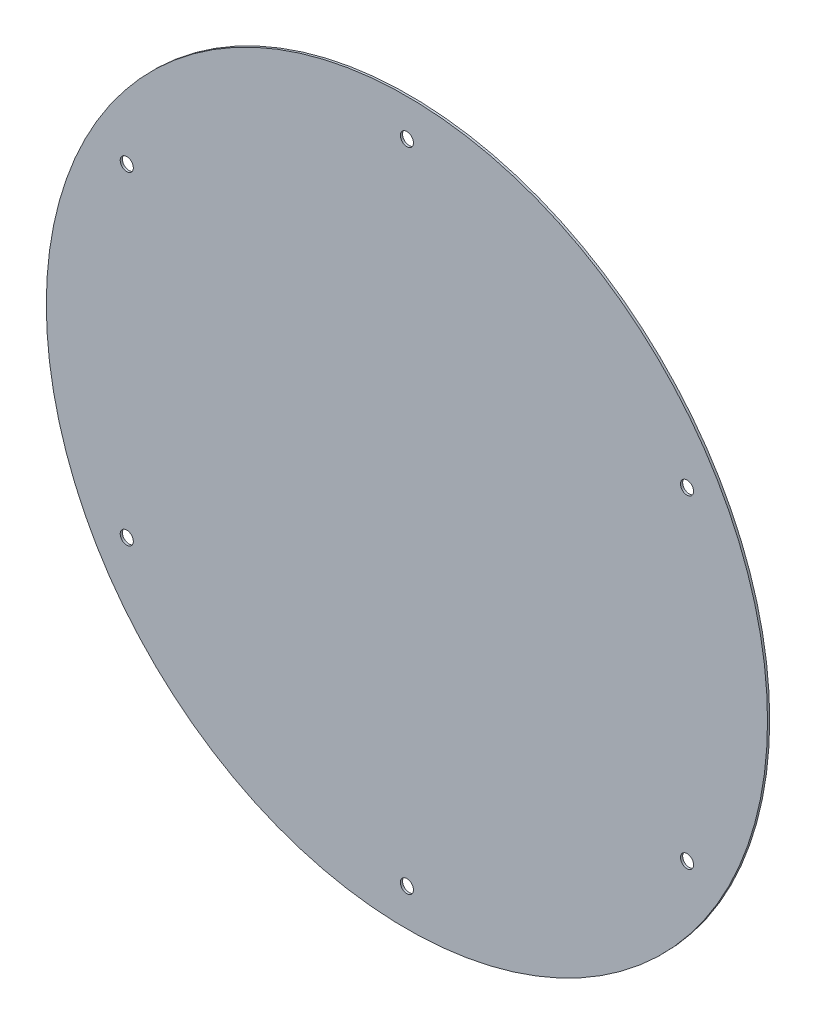
ISO-10303-21;
HEADER;
FILE_DESCRIPTION(('STEP AP214'),'2;1');
FILE_NAME('part.step','',(''),(''),'','','');
FILE_SCHEMA(('AUTOMOTIVE_DESIGN { 1 0 10303 214 1 1 1 1 }'));
ENDSEC;
DATA;
#1=APPLICATION_CONTEXT('core data for automotive mechanical design processes');
#2=APPLICATION_PROTOCOL_DEFINITION('international standard','automotive_design',2000,#1);
#3=PRODUCT_CONTEXT('',#1,'mechanical');
#4=PRODUCT('Part','Part','',(#3));
#5=PRODUCT_RELATED_PRODUCT_CATEGORY('part','',(#4));
#6=PRODUCT_DEFINITION_FORMATION('','',#4);
#7=PRODUCT_DEFINITION_CONTEXT('part definition',#1,'design');
#8=PRODUCT_DEFINITION('design','',#6,#7);
#9=PRODUCT_DEFINITION_SHAPE('','',#8);
#10=(LENGTH_UNIT() NAMED_UNIT(*) SI_UNIT(.MILLI.,.METRE.));
#11=(NAMED_UNIT(*) PLANE_ANGLE_UNIT() SI_UNIT($,.RADIAN.));
#12=(NAMED_UNIT(*) SI_UNIT($,.STERADIAN.) SOLID_ANGLE_UNIT());
#13=UNCERTAINTY_MEASURE_WITH_UNIT(LENGTH_MEASURE(1.E-05),#10,'distance_accuracy_value','');
#14=(GEOMETRIC_REPRESENTATION_CONTEXT(3) GLOBAL_UNCERTAINTY_ASSIGNED_CONTEXT((#13)) GLOBAL_UNIT_ASSIGNED_CONTEXT((#10,
#11,#12)) REPRESENTATION_CONTEXT('',''));
#15=CARTESIAN_POINT('',(0.,0.,0.));
#16=DIRECTION('',(0.,0.,1.));
#17=DIRECTION('',(1.,0.,0.));
#18=AXIS2_PLACEMENT_3D('',#15,#16,#17);
#19=CARTESIAN_POINT('',(0.,0.,0.5));
#20=DIRECTION('',(0.,0.,1.));
#21=DIRECTION('',(1.,0.,0.));
#22=AXIS2_PLACEMENT_3D('',#19,#20,#21);
#23=PLANE('',#22);
#24=CARTESIAN_POINT('',(-64.0858798800485,-36.9999999999999,0.5));
#25=DIRECTION('',(0.,0.,1.));
#26=DIRECTION('',(1.,0.,0.));
#27=AXIS2_PLACEMENT_3D('',#24,#25,#26);
#28=CIRCLE('',#27,1.5);
#29=CARTESIAN_POINT('',(-62.5858798800485,-36.9999999999999,0.5));
#30=VERTEX_POINT('',#29);
#31=EDGE_CURVE('E67',#30,#30,#28,.T.);
#32=ORIENTED_EDGE('',*,*,#31,.F.);
#33=EDGE_LOOP('',(#32));
#34=FACE_BOUND('',#33,.T.);
#35=CARTESIAN_POINT('',(64.0858798800485,36.9999999999999,0.5));
#36=DIRECTION('',(0.,0.,1.));
#37=DIRECTION('',(1.,0.,0.));
#38=AXIS2_PLACEMENT_3D('',#35,#36,#37);
#39=CIRCLE('',#38,1.49999999999998);
#40=CARTESIAN_POINT('',(65.5858798800485,36.9999999999999,0.5));
#41=VERTEX_POINT('',#40);
#42=EDGE_CURVE('E55',#41,#41,#39,.T.);
#43=ORIENTED_EDGE('',*,*,#42,.F.);
#44=EDGE_LOOP('',(#43));
#45=FACE_BOUND('',#44,.T.);
#46=CARTESIAN_POINT('',(0.,74.,0.5));
#47=DIRECTION('',(0.,0.,1.));
#48=DIRECTION('',(1.,0.,0.));
#49=AXIS2_PLACEMENT_3D('',#46,#47,#48);
#50=CIRCLE('',#49,1.5);
#51=CARTESIAN_POINT('',(1.5,74.,0.5));
#52=VERTEX_POINT('',#51);
#53=EDGE_CURVE('E44',#52,#52,#50,.T.);
#54=ORIENTED_EDGE('',*,*,#53,.F.);
#55=EDGE_LOOP('',(#54));
#56=FACE_BOUND('',#55,.T.);
#57=CARTESIAN_POINT('',(0.,0.,0.5));
#58=DIRECTION('',(0.,0.,1.));
#59=DIRECTION('',(1.,0.,0.));
#60=AXIS2_PLACEMENT_3D('',#57,#58,#59);
#61=CIRCLE('',#60,82.5);
#62=CARTESIAN_POINT('',(82.5,0.,0.5));
#63=VERTEX_POINT('',#62);
#64=EDGE_CURVE('E10',#63,#63,#61,.T.);
#65=ORIENTED_EDGE('',*,*,#64,.T.);
#66=EDGE_LOOP('',(#65));
#67=FACE_BOUND('',#66,.T.);
#68=CARTESIAN_POINT('',(0.,-74.,0.5));
#69=DIRECTION('',(0.,0.,1.));
#70=DIRECTION('',(1.,0.,0.));
#71=AXIS2_PLACEMENT_3D('',#68,#69,#70);
#72=CIRCLE('',#71,1.5);
#73=CARTESIAN_POINT('',(1.5,-74.,0.5));
#74=VERTEX_POINT('',#73);
#75=EDGE_CURVE('E49',#74,#74,#72,.T.);
#76=ORIENTED_EDGE('',*,*,#75,.F.);
#77=EDGE_LOOP('',(#76));
#78=FACE_BOUND('',#77,.T.);
#79=CARTESIAN_POINT('',(64.0858798800485,-36.9999999999999,0.5));
#80=DIRECTION('',(0.,0.,1.));
#81=DIRECTION('',(1.,0.,0.));
#82=AXIS2_PLACEMENT_3D('',#79,#80,#81);
#83=CIRCLE('',#82,1.49999999999998);
#84=CARTESIAN_POINT('',(65.5858798800485,-36.9999999999999,0.5));
#85=VERTEX_POINT('',#84);
#86=EDGE_CURVE('E61',#85,#85,#83,.T.);
#87=ORIENTED_EDGE('',*,*,#86,.F.);
#88=EDGE_LOOP('',(#87));
#89=FACE_BOUND('',#88,.T.);
#90=CARTESIAN_POINT('',(-64.0858798800485,36.9999999999999,0.5));
#91=DIRECTION('',(0.,0.,1.));
#92=DIRECTION('',(1.,0.,0.));
#93=AXIS2_PLACEMENT_3D('',#90,#91,#92);
#94=CIRCLE('',#93,1.5);
#95=CARTESIAN_POINT('',(-62.5858798800485,36.9999999999999,0.5));
#96=VERTEX_POINT('',#95);
#97=EDGE_CURVE('E73',#96,#96,#94,.T.);
#98=ORIENTED_EDGE('',*,*,#97,.F.);
#99=EDGE_LOOP('',(#98));
#100=FACE_BOUND('',#99,.T.);
#101=ADVANCED_FACE('F33',(#34,#45,#56,#67,#78,#89,#100),#23,.T.);
#102=CARTESIAN_POINT('',(0.,0.,0.));
#103=DIRECTION('',(0.,0.,1.));
#104=DIRECTION('',(1.,0.,0.));
#105=AXIS2_PLACEMENT_3D('',#102,#103,#104);
#106=PLANE('',#105);
#107=CARTESIAN_POINT('',(0.,0.,0.));
#108=DIRECTION('',(0.,0.,1.));
#109=DIRECTION('',(1.,0.,0.));
#110=AXIS2_PLACEMENT_3D('',#107,#108,#109);
#111=CIRCLE('',#110,82.5);
#112=CARTESIAN_POINT('',(82.5,0.,0.));
#113=VERTEX_POINT('',#112);
#114=EDGE_CURVE('E37',#113,#113,#111,.T.);
#115=ORIENTED_EDGE('',*,*,#114,.F.);
#116=EDGE_LOOP('',(#115));
#117=FACE_BOUND('',#116,.T.);
#118=CARTESIAN_POINT('',(0.,74.,0.));
#119=DIRECTION('',(0.,0.,1.));
#120=DIRECTION('',(1.,0.,0.));
#121=AXIS2_PLACEMENT_3D('',#118,#119,#120);
#122=CIRCLE('',#121,1.5);
#123=CARTESIAN_POINT('',(1.5,74.,0.));
#124=VERTEX_POINT('',#123);
#125=EDGE_CURVE('E46',#124,#124,#122,.T.);
#126=ORIENTED_EDGE('',*,*,#125,.T.);
#127=EDGE_LOOP('',(#126));
#128=FACE_BOUND('',#127,.T.);
#129=CARTESIAN_POINT('',(0.,-74.,0.));
#130=DIRECTION('',(0.,0.,1.));
#131=DIRECTION('',(1.,0.,0.));
#132=AXIS2_PLACEMENT_3D('',#129,#130,#131);
#133=CIRCLE('',#132,1.5);
#134=CARTESIAN_POINT('',(1.5,-74.,0.));
#135=VERTEX_POINT('',#134);
#136=EDGE_CURVE('E52',#135,#135,#133,.T.);
#137=ORIENTED_EDGE('',*,*,#136,.T.);
#138=EDGE_LOOP('',(#137));
#139=FACE_BOUND('',#138,.T.);
#140=CARTESIAN_POINT('',(64.0858798800485,36.9999999999999,0.));
#141=DIRECTION('',(0.,0.,1.));
#142=DIRECTION('',(1.,0.,0.));
#143=AXIS2_PLACEMENT_3D('',#140,#141,#142);
#144=CIRCLE('',#143,1.49999999999998);
#145=CARTESIAN_POINT('',(65.5858798800485,36.9999999999999,0.));
#146=VERTEX_POINT('',#145);
#147=EDGE_CURVE('E58',#146,#146,#144,.T.);
#148=ORIENTED_EDGE('',*,*,#147,.T.);
#149=EDGE_LOOP('',(#148));
#150=FACE_BOUND('',#149,.T.);
#151=CARTESIAN_POINT('',(64.0858798800485,-36.9999999999999,0.));
#152=DIRECTION('',(0.,0.,1.));
#153=DIRECTION('',(1.,0.,0.));
#154=AXIS2_PLACEMENT_3D('',#151,#152,#153);
#155=CIRCLE('',#154,1.49999999999998);
#156=CARTESIAN_POINT('',(65.5858798800485,-36.9999999999999,0.));
#157=VERTEX_POINT('',#156);
#158=EDGE_CURVE('E64',#157,#157,#155,.T.);
#159=ORIENTED_EDGE('',*,*,#158,.T.);
#160=EDGE_LOOP('',(#159));
#161=FACE_BOUND('',#160,.T.);
#162=CARTESIAN_POINT('',(-64.0858798800485,-36.9999999999999,0.));
#163=DIRECTION('',(0.,0.,1.));
#164=DIRECTION('',(1.,0.,0.));
#165=AXIS2_PLACEMENT_3D('',#162,#163,#164);
#166=CIRCLE('',#165,1.5);
#167=CARTESIAN_POINT('',(-62.5858798800485,-36.9999999999999,0.));
#168=VERTEX_POINT('',#167);
#169=EDGE_CURVE('E70',#168,#168,#166,.T.);
#170=ORIENTED_EDGE('',*,*,#169,.T.);
#171=EDGE_LOOP('',(#170));
#172=FACE_BOUND('',#171,.T.);
#173=CARTESIAN_POINT('',(-64.0858798800485,36.9999999999999,0.));
#174=DIRECTION('',(0.,0.,1.));
#175=DIRECTION('',(1.,0.,0.));
#176=AXIS2_PLACEMENT_3D('',#173,#174,#175);
#177=CIRCLE('',#176,1.5);
#178=CARTESIAN_POINT('',(-62.5858798800485,36.9999999999999,0.));
#179=VERTEX_POINT('',#178);
#180=EDGE_CURVE('E76',#179,#179,#177,.T.);
#181=ORIENTED_EDGE('',*,*,#180,.T.);
#182=EDGE_LOOP('',(#181));
#183=FACE_BOUND('',#182,.T.);
#184=ADVANCED_FACE('F86',(#117,#128,#139,#150,#161,#172,#183),#106,.F.);
#185=CARTESIAN_POINT('',(0.,0.,0.5));
#186=DIRECTION('',(0.,0.,-1.));
#187=DIRECTION('',(-1.,0.,0.));
#188=AXIS2_PLACEMENT_3D('',#185,#186,#187);
#189=CYLINDRICAL_SURFACE('',#188,82.5);
#190=ORIENTED_EDGE('',*,*,#64,.F.);
#191=EDGE_LOOP('',(#190));
#192=FACE_BOUND('',#191,.T.);
#193=ORIENTED_EDGE('',*,*,#114,.T.);
#194=EDGE_LOOP('',(#193));
#195=FACE_BOUND('',#194,.T.);
#196=ADVANCED_FACE('F35',(#192,#195),#189,.T.);
#197=CARTESIAN_POINT('',(0.,74.,0.5));
#198=DIRECTION('',(0.,0.,-1.));
#199=DIRECTION('',(-1.,0.,0.));
#200=AXIS2_PLACEMENT_3D('',#197,#198,#199);
#201=CYLINDRICAL_SURFACE('',#200,1.5);
#202=ORIENTED_EDGE('',*,*,#53,.T.);
#203=EDGE_LOOP('',(#202));
#204=FACE_BOUND('',#203,.T.);
#205=ORIENTED_EDGE('',*,*,#125,.F.);
#206=EDGE_LOOP('',(#205));
#207=FACE_BOUND('',#206,.T.);
#208=ADVANCED_FACE('F96',(#204,#207),#201,.F.);
#209=CARTESIAN_POINT('',(0.,-74.,0.5));
#210=DIRECTION('',(0.,0.,-1.));
#211=DIRECTION('',(-1.,0.,0.));
#212=AXIS2_PLACEMENT_3D('',#209,#210,#211);
#213=CYLINDRICAL_SURFACE('',#212,1.5);
#214=ORIENTED_EDGE('',*,*,#75,.T.);
#215=EDGE_LOOP('',(#214));
#216=FACE_BOUND('',#215,.T.);
#217=ORIENTED_EDGE('',*,*,#136,.F.);
#218=EDGE_LOOP('',(#217));
#219=FACE_BOUND('',#218,.T.);
#220=ADVANCED_FACE('F99',(#216,#219),#213,.F.);
#221=CARTESIAN_POINT('',(64.0858798800485,36.9999999999999,0.5));
#222=DIRECTION('',(0.,0.,-1.));
#223=DIRECTION('',(-1.,0.,0.));
#224=AXIS2_PLACEMENT_3D('',#221,#222,#223);
#225=CYLINDRICAL_SURFACE('',#224,1.49999999999998);
#226=ORIENTED_EDGE('',*,*,#42,.T.);
#227=EDGE_LOOP('',(#226));
#228=FACE_BOUND('',#227,.T.);
#229=ORIENTED_EDGE('',*,*,#147,.F.);
#230=EDGE_LOOP('',(#229));
#231=FACE_BOUND('',#230,.T.);
#232=ADVANCED_FACE('F103',(#228,#231),#225,.F.);
#233=CARTESIAN_POINT('',(64.0858798800485,-36.9999999999999,0.5));
#234=DIRECTION('',(0.,0.,-1.));
#235=DIRECTION('',(-1.,0.,0.));
#236=AXIS2_PLACEMENT_3D('',#233,#234,#235);
#237=CYLINDRICAL_SURFACE('',#236,1.49999999999998);
#238=ORIENTED_EDGE('',*,*,#86,.T.);
#239=EDGE_LOOP('',(#238));
#240=FACE_BOUND('',#239,.T.);
#241=ORIENTED_EDGE('',*,*,#158,.F.);
#242=EDGE_LOOP('',(#241));
#243=FACE_BOUND('',#242,.T.);
#244=ADVANCED_FACE('F107',(#240,#243),#237,.F.);
#245=CARTESIAN_POINT('',(-64.0858798800485,-36.9999999999999,0.5));
#246=DIRECTION('',(0.,0.,-1.));
#247=DIRECTION('',(-1.,0.,0.));
#248=AXIS2_PLACEMENT_3D('',#245,#246,#247);
#249=CYLINDRICAL_SURFACE('',#248,1.5);
#250=ORIENTED_EDGE('',*,*,#31,.T.);
#251=EDGE_LOOP('',(#250));
#252=FACE_BOUND('',#251,.T.);
#253=ORIENTED_EDGE('',*,*,#169,.F.);
#254=EDGE_LOOP('',(#253));
#255=FACE_BOUND('',#254,.T.);
#256=ADVANCED_FACE('F111',(#252,#255),#249,.F.);
#257=CARTESIAN_POINT('',(-64.0858798800485,36.9999999999999,0.5));
#258=DIRECTION('',(0.,0.,-1.));
#259=DIRECTION('',(-1.,0.,0.));
#260=AXIS2_PLACEMENT_3D('',#257,#258,#259);
#261=CYLINDRICAL_SURFACE('',#260,1.5);
#262=ORIENTED_EDGE('',*,*,#97,.T.);
#263=EDGE_LOOP('',(#262));
#264=FACE_BOUND('',#263,.T.);
#265=ORIENTED_EDGE('',*,*,#180,.F.);
#266=EDGE_LOOP('',(#265));
#267=FACE_BOUND('',#266,.T.);
#268=ADVANCED_FACE('F82',(#264,#267),#261,.F.);
#269=CLOSED_SHELL('',(#101,#184,#196,#208,#220,#232,#244,#256,#268));
#270=MANIFOLD_SOLID_BREP('B2',#269);
#271=ADVANCED_BREP_SHAPE_REPRESENTATION('',(#18,#270),#14);
#272=SHAPE_DEFINITION_REPRESENTATION(#9,#271);
ENDSEC;
END-ISO-10303-21;
